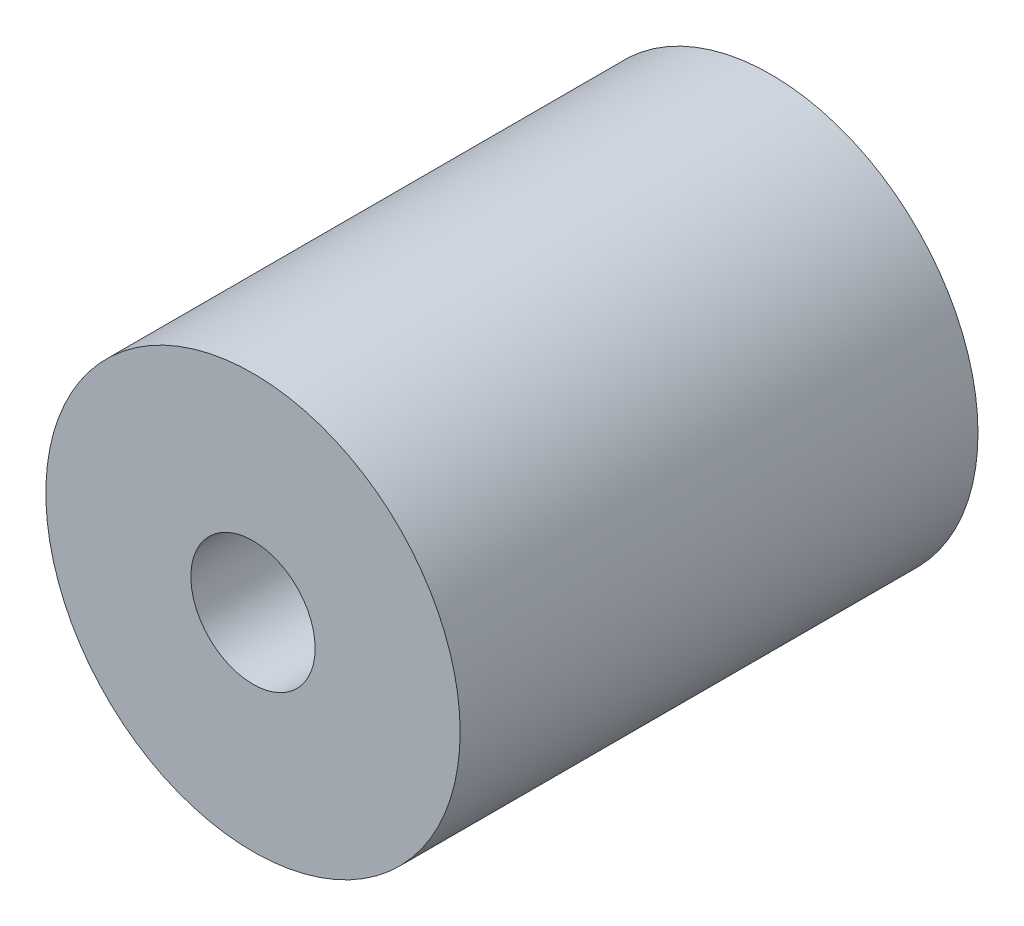
ISO-10303-21;
HEADER;
FILE_DESCRIPTION(('STEP AP214'),'2;1');
FILE_NAME('part.step','',(''),(''),'','','');
FILE_SCHEMA(('AUTOMOTIVE_DESIGN { 1 0 10303 214 1 1 1 1 }'));
ENDSEC;
DATA;
#1=APPLICATION_CONTEXT('core data for automotive mechanical design processes');
#2=APPLICATION_PROTOCOL_DEFINITION('international standard','automotive_design',2000,#1);
#3=PRODUCT_CONTEXT('',#1,'mechanical');
#4=PRODUCT('Part','Part','',(#3));
#5=PRODUCT_RELATED_PRODUCT_CATEGORY('part','',(#4));
#6=PRODUCT_DEFINITION_FORMATION('','',#4);
#7=PRODUCT_DEFINITION_CONTEXT('part definition',#1,'design');
#8=PRODUCT_DEFINITION('design','',#6,#7);
#9=PRODUCT_DEFINITION_SHAPE('','',#8);
#10=(LENGTH_UNIT() NAMED_UNIT(*) SI_UNIT(.MILLI.,.METRE.));
#11=(NAMED_UNIT(*) PLANE_ANGLE_UNIT() SI_UNIT($,.RADIAN.));
#12=(NAMED_UNIT(*) SI_UNIT($,.STERADIAN.) SOLID_ANGLE_UNIT());
#13=UNCERTAINTY_MEASURE_WITH_UNIT(LENGTH_MEASURE(1.E-05),#10,'distance_accuracy_value','');
#14=(GEOMETRIC_REPRESENTATION_CONTEXT(3) GLOBAL_UNCERTAINTY_ASSIGNED_CONTEXT((#13)) GLOBAL_UNIT_ASSIGNED_CONTEXT((#10,
#11,#12)) REPRESENTATION_CONTEXT('',''));
#15=CARTESIAN_POINT('',(0.,0.,0.));
#16=DIRECTION('',(0.,0.,1.));
#17=DIRECTION('',(1.,0.,0.));
#18=AXIS2_PLACEMENT_3D('',#15,#16,#17);
#19=CARTESIAN_POINT('',(0.,0.,0.));
#20=DIRECTION('',(0.,0.,1.));
#21=DIRECTION('',(1.,0.,0.));
#22=AXIS2_PLACEMENT_3D('',#19,#20,#21);
#23=CYLINDRICAL_SURFACE('',#22,3.);
#24=CARTESIAN_POINT('',(0.,0.,25.));
#25=DIRECTION('',(0.,0.,1.));
#26=DIRECTION('',(1.,0.,0.));
#27=AXIS2_PLACEMENT_3D('',#24,#25,#26);
#28=CIRCLE('',#27,3.);
#29=CARTESIAN_POINT('',(3.,0.,25.));
#30=VERTEX_POINT('',#29);
#31=EDGE_CURVE('E57',#30,#30,#28,.T.);
#32=ORIENTED_EDGE('',*,*,#31,.T.);
#33=EDGE_LOOP('',(#32));
#34=FACE_BOUND('',#33,.T.);
#35=CARTESIAN_POINT('',(0.,0.,12.5));
#36=DIRECTION('',(0.,0.,-1.));
#37=DIRECTION('',(-1.,0.,0.));
#38=AXIS2_PLACEMENT_3D('',#35,#36,#37);
#39=CIRCLE('',#38,3.);
#40=CARTESIAN_POINT('',(-3.,0.,12.5));
#41=VERTEX_POINT('',#40);
#42=EDGE_CURVE('E45',#41,#41,#39,.F.);
#43=ORIENTED_EDGE('',*,*,#42,.F.);
#44=EDGE_LOOP('',(#43));
#45=FACE_BOUND('',#44,.T.);
#46=ADVANCED_FACE('F41',(#34,#45),#23,.F.);
#47=CARTESIAN_POINT('',(0.,0.,25.));
#48=DIRECTION('',(0.,0.,-1.));
#49=DIRECTION('',(-1.,0.,0.));
#50=AXIS2_PLACEMENT_3D('',#47,#48,#49);
#51=CYLINDRICAL_SURFACE('',#50,10.);
#52=CARTESIAN_POINT('',(0.,0.,25.));
#53=DIRECTION('',(0.,0.,1.));
#54=DIRECTION('',(1.,0.,0.));
#55=AXIS2_PLACEMENT_3D('',#52,#53,#54);
#56=CIRCLE('',#55,10.);
#57=CARTESIAN_POINT('',(10.,0.,25.));
#58=VERTEX_POINT('',#57);
#59=EDGE_CURVE('E10',#58,#58,#56,.T.);
#60=ORIENTED_EDGE('',*,*,#59,.F.);
#61=EDGE_LOOP('',(#60));
#62=FACE_BOUND('',#61,.T.);
#63=CARTESIAN_POINT('',(0.,0.,0.));
#64=DIRECTION('',(0.,0.,1.));
#65=DIRECTION('',(1.,0.,0.));
#66=AXIS2_PLACEMENT_3D('',#63,#64,#65);
#67=CIRCLE('',#66,10.);
#68=CARTESIAN_POINT('',(10.,0.,0.));
#69=VERTEX_POINT('',#68);
#70=EDGE_CURVE('E50',#69,#69,#67,.T.);
#71=ORIENTED_EDGE('',*,*,#70,.T.);
#72=EDGE_LOOP('',(#71));
#73=FACE_BOUND('',#72,.T.);
#74=ADVANCED_FACE('F43',(#62,#73),#51,.T.);
#75=CARTESIAN_POINT('',(0.,0.,25.));
#76=DIRECTION('',(0.,0.,1.));
#77=DIRECTION('',(1.,0.,0.));
#78=AXIS2_PLACEMENT_3D('',#75,#76,#77);
#79=PLANE('',#78);
#80=ORIENTED_EDGE('',*,*,#31,.F.);
#81=EDGE_LOOP('',(#80));
#82=FACE_BOUND('',#81,.T.);
#83=ORIENTED_EDGE('',*,*,#59,.T.);
#84=EDGE_LOOP('',(#83));
#85=FACE_BOUND('',#84,.T.);
#86=ADVANCED_FACE('F87',(#82,#85),#79,.T.);
#87=CARTESIAN_POINT('',(0.,0.,0.));
#88=DIRECTION('',(0.,0.,1.));
#89=DIRECTION('',(1.,0.,0.));
#90=AXIS2_PLACEMENT_3D('',#87,#88,#89);
#91=PLANE('',#90);
#92=CARTESIAN_POINT('',(0.,0.,0.));
#93=DIRECTION('',(0.,0.,-1.));
#94=DIRECTION('',(-1.,0.,0.));
#95=AXIS2_PLACEMENT_3D('',#92,#93,#94);
#96=CIRCLE('',#95,4.);
#97=CARTESIAN_POINT('',(-4.,0.,0.));
#98=VERTEX_POINT('',#97);
#99=EDGE_CURVE('E62',#98,#98,#96,.T.);
#100=ORIENTED_EDGE('',*,*,#99,.F.);
#101=EDGE_LOOP('',(#100));
#102=FACE_BOUND('',#101,.T.);
#103=ORIENTED_EDGE('',*,*,#70,.F.);
#104=EDGE_LOOP('',(#103));
#105=FACE_BOUND('',#104,.T.);
#106=ADVANCED_FACE('F93',(#102,#105),#91,.F.);
#107=CARTESIAN_POINT('',(0.,0.,12.5));
#108=DIRECTION('',(0.,0.,-1.));
#109=DIRECTION('',(-1.,0.,0.));
#110=AXIS2_PLACEMENT_3D('',#107,#108,#109);
#111=PLANE('',#110);
#112=CARTESIAN_POINT('',(0.,0.,12.5));
#113=DIRECTION('',(0.,0.,-1.));
#114=DIRECTION('',(-1.,0.,0.));
#115=AXIS2_PLACEMENT_3D('',#112,#113,#114);
#116=CIRCLE('',#115,4.);
#117=CARTESIAN_POINT('',(-4.,0.,12.5));
#118=VERTEX_POINT('',#117);
#119=EDGE_CURVE('E66',#118,#118,#116,.T.);
#120=ORIENTED_EDGE('',*,*,#119,.T.);
#121=EDGE_LOOP('',(#120));
#122=FACE_BOUND('',#121,.T.);
#123=ORIENTED_EDGE('',*,*,#42,.T.);
#124=EDGE_LOOP('',(#123));
#125=FACE_BOUND('',#124,.T.);
#126=ADVANCED_FACE('F77',(#122,#125),#111,.T.);
#127=CARTESIAN_POINT('',(0.,0.,12.5));
#128=DIRECTION('',(0.,0.,-1.));
#129=DIRECTION('',(-1.,0.,0.));
#130=AXIS2_PLACEMENT_3D('',#127,#128,#129);
#131=CYLINDRICAL_SURFACE('',#130,4.);
#132=ORIENTED_EDGE('',*,*,#119,.F.);
#133=EDGE_LOOP('',(#132));
#134=FACE_BOUND('',#133,.T.);
#135=ORIENTED_EDGE('',*,*,#99,.T.);
#136=EDGE_LOOP('',(#135));
#137=FACE_BOUND('',#136,.T.);
#138=ADVANCED_FACE('F91',(#134,#137),#131,.F.);
#139=CLOSED_SHELL('',(#46,#74,#86,#106,#126,#138));
#140=MANIFOLD_SOLID_BREP('B2',#139);
#141=ADVANCED_BREP_SHAPE_REPRESENTATION('',(#18,#140),#14);
#142=SHAPE_DEFINITION_REPRESENTATION(#9,#141);
ENDSEC;
END-ISO-10303-21;
